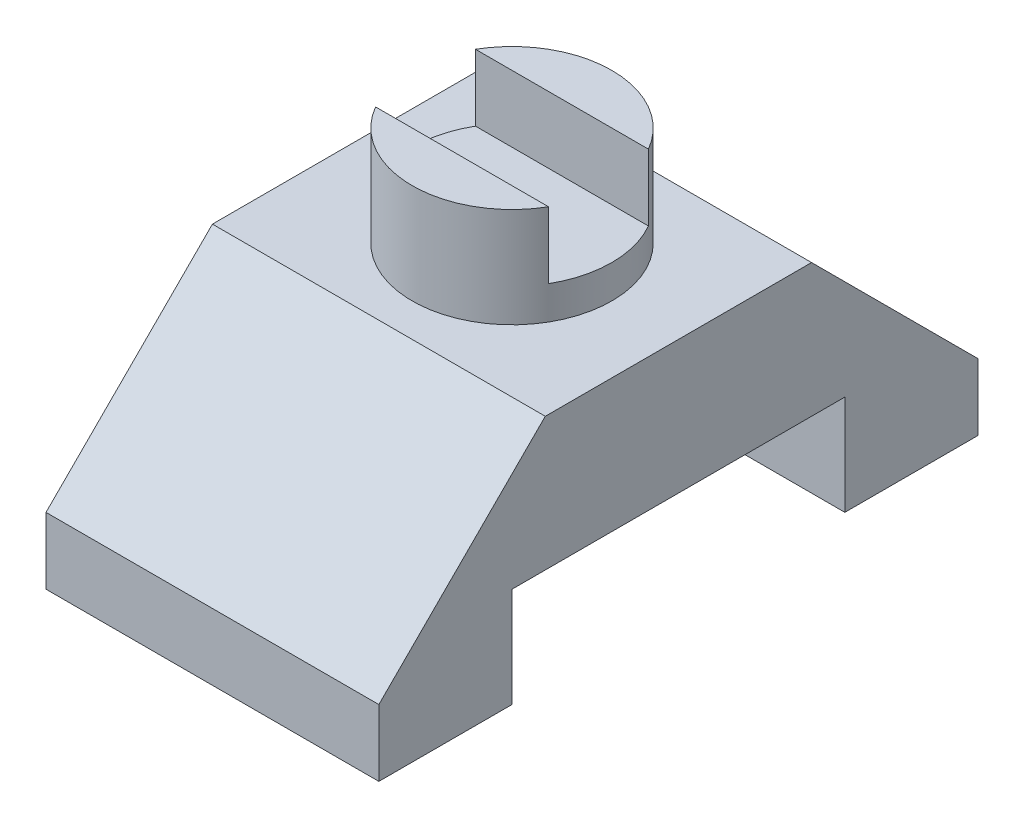
ISO-10303-21;
HEADER;
FILE_DESCRIPTION(('STEP AP214'),'2;1');
FILE_NAME('part.step','',(''),(''),'','','');
FILE_SCHEMA(('AUTOMOTIVE_DESIGN { 1 0 10303 214 1 1 1 1 }'));
ENDSEC;
DATA;
#1=APPLICATION_CONTEXT('core data for automotive mechanical design processes');
#2=APPLICATION_PROTOCOL_DEFINITION('international standard','automotive_design',2000,#1);
#3=PRODUCT_CONTEXT('',#1,'mechanical');
#4=PRODUCT('Part','Part','',(#3));
#5=PRODUCT_RELATED_PRODUCT_CATEGORY('part','',(#4));
#6=PRODUCT_DEFINITION_FORMATION('','',#4);
#7=PRODUCT_DEFINITION_CONTEXT('part definition',#1,'design');
#8=PRODUCT_DEFINITION('design','',#6,#7);
#9=PRODUCT_DEFINITION_SHAPE('','',#8);
#10=(LENGTH_UNIT() NAMED_UNIT(*) SI_UNIT(.MILLI.,.METRE.));
#11=(NAMED_UNIT(*) PLANE_ANGLE_UNIT() SI_UNIT($,.RADIAN.));
#12=(NAMED_UNIT(*) SI_UNIT($,.STERADIAN.) SOLID_ANGLE_UNIT());
#13=UNCERTAINTY_MEASURE_WITH_UNIT(LENGTH_MEASURE(1.E-05),#10,'distance_accuracy_value','');
#14=(GEOMETRIC_REPRESENTATION_CONTEXT(3) GLOBAL_UNCERTAINTY_ASSIGNED_CONTEXT((#13)) GLOBAL_UNIT_ASSIGNED_CONTEXT((#10,
#11,#12)) REPRESENTATION_CONTEXT('',''));
#15=CARTESIAN_POINT('',(0.,0.,0.));
#16=DIRECTION('',(0.,0.,1.));
#17=DIRECTION('',(1.,0.,0.));
#18=AXIS2_PLACEMENT_3D('',#15,#16,#17);
#19=CARTESIAN_POINT('',(0.,50.,-15.));
#20=DIRECTION('',(0.,1.,0.));
#21=DIRECTION('',(0.,0.,1.));
#22=AXIS2_PLACEMENT_3D('',#19,#20,#21);
#23=PLANE('',#22);
#24=DIRECTION('',(-1.,0.,0.));
#25=VECTOR('',#24,1.);
#26=CARTESIAN_POINT('',(25.001,50.,7.5));
#27=LINE('',#26,#25);
#28=CARTESIAN_POINT('',(12.9903810567666,50.,7.5));
#29=VERTEX_POINT('',#28);
#30=CARTESIAN_POINT('',(-12.9903810567666,50.,7.5));
#31=VERTEX_POINT('',#30);
#32=EDGE_CURVE('E226',#29,#31,#27,.T.);
#33=ORIENTED_EDGE('',*,*,#32,.T.);
#34=CARTESIAN_POINT('',(0.,50.,0.));
#35=DIRECTION('',(0.,-1.,0.));
#36=DIRECTION('',(0.,0.,-1.));
#37=AXIS2_PLACEMENT_3D('',#34,#35,#36);
#38=CIRCLE('',#37,15.);
#39=EDGE_CURVE('E213',#29,#31,#38,.T.);
#40=ORIENTED_EDGE('',*,*,#39,.F.);
#41=EDGE_LOOP('',(#33,#40));
#42=FACE_BOUND('',#41,.T.);
#43=ADVANCED_FACE('F33',(#42),#23,.T.);
#44=CARTESIAN_POINT('',(0.,-6.40699537949249,0.));
#45=DIRECTION('',(0.,-1.,0.));
#46=DIRECTION('',(0.,0.,-1.));
#47=AXIS2_PLACEMENT_3D('',#44,#45,#46);
#48=CYLINDRICAL_SURFACE('',#47,15.);
#49=DIRECTION('',(0.,-1.,0.));
#50=VECTOR('',#49,1.);
#51=CARTESIAN_POINT('',(-12.9903810567666,-6.40699537949249,7.50000000000001));
#52=LINE('',#51,#50);
#53=CARTESIAN_POINT('',(-12.9903810567666,40.,7.5));
#54=VERTEX_POINT('',#53);
#55=EDGE_CURVE('E242',#31,#54,#52,.T.);
#56=ORIENTED_EDGE('',*,*,#55,.T.);
#57=CARTESIAN_POINT('',(0.,40.,0.));
#58=DIRECTION('',(0.,-1.,0.));
#59=DIRECTION('',(0.,0.,-1.));
#60=AXIS2_PLACEMENT_3D('',#57,#58,#59);
#61=CIRCLE('',#60,15.);
#62=CARTESIAN_POINT('',(-12.9903810567666,40.,-7.5));
#63=VERTEX_POINT('',#62);
#64=EDGE_CURVE('E238',#54,#63,#61,.T.);
#65=ORIENTED_EDGE('',*,*,#64,.T.);
#66=DIRECTION('',(0.,-1.,0.));
#67=VECTOR('',#66,1.);
#68=CARTESIAN_POINT('',(-12.9903810567666,-6.40699537949249,-7.50000000000001));
#69=LINE('',#68,#67);
#70=CARTESIAN_POINT('',(-12.9903810567666,50.,-7.5));
#71=VERTEX_POINT('',#70);
#72=EDGE_CURVE('E239',#63,#71,#69,.F.);
#73=ORIENTED_EDGE('',*,*,#72,.T.);
#74=CARTESIAN_POINT('',(12.9903810567666,50.,-7.5));
#75=VERTEX_POINT('',#74);
#76=EDGE_CURVE('E216',#71,#75,#38,.T.);
#77=ORIENTED_EDGE('',*,*,#76,.T.);
#78=DIRECTION('',(0.,-1.,0.));
#79=VECTOR('',#78,1.);
#80=CARTESIAN_POINT('',(12.9903810567666,-6.40699537949249,-7.50000000000001));
#81=LINE('',#80,#79);
#82=CARTESIAN_POINT('',(12.9903810567666,40.,-7.5));
#83=VERTEX_POINT('',#82);
#84=EDGE_CURVE('E235',#83,#75,#81,.F.);
#85=ORIENTED_EDGE('',*,*,#84,.F.);
#86=CARTESIAN_POINT('',(0.,40.,0.));
#87=DIRECTION('',(0.,1.,0.));
#88=DIRECTION('',(0.,0.,1.));
#89=AXIS2_PLACEMENT_3D('',#86,#87,#88);
#90=CIRCLE('',#89,15.);
#91=CARTESIAN_POINT('',(12.9903810567666,40.,7.5));
#92=VERTEX_POINT('',#91);
#93=EDGE_CURVE('E232',#92,#83,#90,.T.);
#94=ORIENTED_EDGE('',*,*,#93,.F.);
#95=DIRECTION('',(0.,-1.,0.));
#96=VECTOR('',#95,1.);
#97=CARTESIAN_POINT('',(12.9903810567666,-6.40699537949249,7.50000000000001));
#98=LINE('',#97,#96);
#99=EDGE_CURVE('E229',#29,#92,#98,.T.);
#100=ORIENTED_EDGE('',*,*,#99,.F.);
#101=ORIENTED_EDGE('',*,*,#39,.T.);
#102=EDGE_LOOP('',(#56,#65,#73,#77,#85,#94,#100,#101));
#103=FACE_BOUND('',#102,.T.);
#104=CARTESIAN_POINT('',(0.,35.,0.));
#105=DIRECTION('',(0.,-1.,0.));
#106=DIRECTION('',(0.,0.,-1.));
#107=AXIS2_PLACEMENT_3D('',#104,#105,#106);
#108=CIRCLE('',#107,15.);
#109=CARTESIAN_POINT('',(0.,35.,-15.));
#110=VERTEX_POINT('',#109);
#111=EDGE_CURVE('E149',#110,#110,#108,.T.);
#112=ORIENTED_EDGE('',*,*,#111,.F.);
#113=EDGE_LOOP('',(#112));
#114=FACE_BOUND('',#113,.T.);
#115=ADVANCED_FACE('F249',(#103,#114),#48,.T.);
#116=ORIENTED_EDGE('',*,*,#76,.F.);
#117=DIRECTION('',(-1.,0.,0.));
#118=VECTOR('',#117,1.);
#119=CARTESIAN_POINT('',(25.001,50.,-7.5));
#120=LINE('',#119,#118);
#121=EDGE_CURVE('E223',#75,#71,#120,.T.);
#122=ORIENTED_EDGE('',*,*,#121,.F.);
#123=EDGE_LOOP('',(#116,#122));
#124=FACE_BOUND('',#123,.T.);
#125=ADVANCED_FACE('F280',(#124),#23,.T.);
#126=CARTESIAN_POINT('',(25.,10.,45.));
#127=DIRECTION('',(0.,0.,-1.));
#128=DIRECTION('',(-1.,0.,0.));
#129=AXIS2_PLACEMENT_3D('',#126,#127,#128);
#130=PLANE('',#129);
#131=DIRECTION('',(0.,-1.,0.));
#132=VECTOR('',#131,1.);
#133=CARTESIAN_POINT('',(-25.,10.,45.));
#134=LINE('',#133,#132);
#135=CARTESIAN_POINT('',(-25.,10.,45.));
#136=VERTEX_POINT('',#135);
#137=CARTESIAN_POINT('',(-25.,0.,45.));
#138=VERTEX_POINT('',#137);
#139=EDGE_CURVE('E145',#136,#138,#134,.T.);
#140=ORIENTED_EDGE('',*,*,#139,.T.);
#141=DIRECTION('',(-1.,0.,0.));
#142=VECTOR('',#141,1.);
#143=CARTESIAN_POINT('',(25.,0.,45.));
#144=LINE('',#143,#142);
#145=CARTESIAN_POINT('',(25.,0.,45.));
#146=VERTEX_POINT('',#145);
#147=EDGE_CURVE('E11',#146,#138,#144,.T.);
#148=ORIENTED_EDGE('',*,*,#147,.F.);
#149=DIRECTION('',(0.,-1.,0.));
#150=VECTOR('',#149,1.);
#151=CARTESIAN_POINT('',(25.,10.,45.));
#152=LINE('',#151,#150);
#153=CARTESIAN_POINT('',(25.,10.,45.));
#154=VERTEX_POINT('',#153);
#155=EDGE_CURVE('E164',#154,#146,#152,.T.);
#156=ORIENTED_EDGE('',*,*,#155,.F.);
#157=DIRECTION('',(-1.,0.,0.));
#158=VECTOR('',#157,1.);
#159=CARTESIAN_POINT('',(25.,10.,45.));
#160=LINE('',#159,#158);
#161=EDGE_CURVE('E141',#154,#136,#160,.T.);
#162=ORIENTED_EDGE('',*,*,#161,.T.);
#163=EDGE_LOOP('',(#140,#148,#156,#162));
#164=FACE_BOUND('',#163,.T.);
#165=ADVANCED_FACE('F35',(#164),#130,.F.);
#166=CARTESIAN_POINT('',(25.,0.,45.));
#167=DIRECTION('',(0.,1.,0.));
#168=DIRECTION('',(0.,0.,1.));
#169=AXIS2_PLACEMENT_3D('',#166,#167,#168);
#170=PLANE('',#169);
#171=DIRECTION('',(0.,0.,-1.));
#172=VECTOR('',#171,1.);
#173=CARTESIAN_POINT('',(-25.,0.,45.));
#174=LINE('',#173,#172);
#175=CARTESIAN_POINT('',(-25.,0.,25.));
#176=VERTEX_POINT('',#175);
#177=EDGE_CURVE('E148',#138,#176,#174,.T.);
#178=ORIENTED_EDGE('',*,*,#177,.T.);
#179=DIRECTION('',(-1.,0.,0.));
#180=VECTOR('',#179,1.);
#181=CARTESIAN_POINT('',(25.,0.,25.));
#182=LINE('',#181,#180);
#183=CARTESIAN_POINT('',(25.,0.,25.));
#184=VERTEX_POINT('',#183);
#185=EDGE_CURVE('E42',#184,#176,#182,.T.);
#186=ORIENTED_EDGE('',*,*,#185,.F.);
#187=DIRECTION('',(0.,0.,-1.));
#188=VECTOR('',#187,1.);
#189=CARTESIAN_POINT('',(25.,0.,45.));
#190=LINE('',#189,#188);
#191=EDGE_CURVE('E100',#146,#184,#190,.T.);
#192=ORIENTED_EDGE('',*,*,#191,.F.);
#193=ORIENTED_EDGE('',*,*,#147,.T.);
#194=EDGE_LOOP('',(#178,#186,#192,#193));
#195=FACE_BOUND('',#194,.T.);
#196=ADVANCED_FACE('F287',(#195),#170,.F.);
#197=CARTESIAN_POINT('',(25.,0.,25.));
#198=DIRECTION('',(0.,0.,1.));
#199=DIRECTION('',(1.,0.,0.));
#200=AXIS2_PLACEMENT_3D('',#197,#198,#199);
#201=PLANE('',#200);
#202=DIRECTION('',(0.,1.,0.));
#203=VECTOR('',#202,1.);
#204=CARTESIAN_POINT('',(-25.,0.,25.));
#205=LINE('',#204,#203);
#206=CARTESIAN_POINT('',(-25.,15.,25.));
#207=VERTEX_POINT('',#206);
#208=EDGE_CURVE('E151',#176,#207,#205,.T.);
#209=ORIENTED_EDGE('',*,*,#208,.T.);
#210=DIRECTION('',(-1.,0.,0.));
#211=VECTOR('',#210,1.);
#212=CARTESIAN_POINT('',(25.,15.,25.));
#213=LINE('',#212,#211);
#214=CARTESIAN_POINT('',(25.,15.,25.));
#215=VERTEX_POINT('',#214);
#216=EDGE_CURVE('E177',#215,#207,#213,.T.);
#217=ORIENTED_EDGE('',*,*,#216,.F.);
#218=DIRECTION('',(0.,1.,0.));
#219=VECTOR('',#218,1.);
#220=CARTESIAN_POINT('',(25.,0.,25.));
#221=LINE('',#220,#219);
#222=EDGE_CURVE('E185',#184,#215,#221,.T.);
#223=ORIENTED_EDGE('',*,*,#222,.F.);
#224=ORIENTED_EDGE('',*,*,#185,.T.);
#225=EDGE_LOOP('',(#209,#217,#223,#224));
#226=FACE_BOUND('',#225,.T.);
#227=ADVANCED_FACE('F183',(#226),#201,.F.);
#228=CARTESIAN_POINT('',(25.,15.,25.));
#229=DIRECTION('',(0.,1.,0.));
#230=DIRECTION('',(0.,0.,1.));
#231=AXIS2_PLACEMENT_3D('',#228,#229,#230);
#232=PLANE('',#231);
#233=DIRECTION('',(0.,0.,-1.));
#234=VECTOR('',#233,1.);
#235=CARTESIAN_POINT('',(-25.,15.,25.));
#236=LINE('',#235,#234);
#237=CARTESIAN_POINT('',(-25.,15.,-25.));
#238=VERTEX_POINT('',#237);
#239=EDGE_CURVE('E153',#207,#238,#236,.T.);
#240=ORIENTED_EDGE('',*,*,#239,.T.);
#241=DIRECTION('',(-1.,0.,0.));
#242=VECTOR('',#241,1.);
#243=CARTESIAN_POINT('',(25.,15.,-25.));
#244=LINE('',#243,#242);
#245=CARTESIAN_POINT('',(25.,15.,-25.));
#246=VERTEX_POINT('',#245);
#247=EDGE_CURVE('E174',#246,#238,#244,.T.);
#248=ORIENTED_EDGE('',*,*,#247,.F.);
#249=DIRECTION('',(0.,0.,-1.));
#250=VECTOR('',#249,1.);
#251=CARTESIAN_POINT('',(25.,15.,25.));
#252=LINE('',#251,#250);
#253=EDGE_CURVE('E203',#215,#246,#252,.T.);
#254=ORIENTED_EDGE('',*,*,#253,.F.);
#255=ORIENTED_EDGE('',*,*,#216,.T.);
#256=EDGE_LOOP('',(#240,#248,#254,#255));
#257=FACE_BOUND('',#256,.T.);
#258=ADVANCED_FACE('F194',(#257),#232,.F.);
#259=CARTESIAN_POINT('',(25.,15.,-25.));
#260=DIRECTION('',(0.,0.,-1.));
#261=DIRECTION('',(-1.,0.,0.));
#262=AXIS2_PLACEMENT_3D('',#259,#260,#261);
#263=PLANE('',#262);
#264=DIRECTION('',(0.,-1.,0.));
#265=VECTOR('',#264,1.);
#266=CARTESIAN_POINT('',(-25.,15.,-25.));
#267=LINE('',#266,#265);
#268=CARTESIAN_POINT('',(-25.,0.,-25.));
#269=VERTEX_POINT('',#268);
#270=EDGE_CURVE('E155',#238,#269,#267,.T.);
#271=ORIENTED_EDGE('',*,*,#270,.T.);
#272=DIRECTION('',(-1.,0.,0.));
#273=VECTOR('',#272,1.);
#274=CARTESIAN_POINT('',(25.,0.,-25.));
#275=LINE('',#274,#273);
#276=CARTESIAN_POINT('',(25.,0.,-25.));
#277=VERTEX_POINT('',#276);
#278=EDGE_CURVE('E171',#277,#269,#275,.T.);
#279=ORIENTED_EDGE('',*,*,#278,.F.);
#280=DIRECTION('',(0.,-1.,0.));
#281=VECTOR('',#280,1.);
#282=CARTESIAN_POINT('',(25.,15.,-25.));
#283=LINE('',#282,#281);
#284=EDGE_CURVE('E200',#246,#277,#283,.T.);
#285=ORIENTED_EDGE('',*,*,#284,.F.);
#286=ORIENTED_EDGE('',*,*,#247,.T.);
#287=EDGE_LOOP('',(#271,#279,#285,#286));
#288=FACE_BOUND('',#287,.T.);
#289=ADVANCED_FACE('F198',(#288),#263,.F.);
#290=CARTESIAN_POINT('',(25.,0.,-25.));
#291=DIRECTION('',(0.,1.,0.));
#292=DIRECTION('',(0.,0.,1.));
#293=AXIS2_PLACEMENT_3D('',#290,#291,#292);
#294=PLANE('',#293);
#295=DIRECTION('',(0.,0.,-1.));
#296=VECTOR('',#295,1.);
#297=CARTESIAN_POINT('',(-25.,0.,-25.));
#298=LINE('',#297,#296);
#299=CARTESIAN_POINT('',(-25.,0.,-45.));
#300=VERTEX_POINT('',#299);
#301=EDGE_CURVE('E157',#269,#300,#298,.T.);
#302=ORIENTED_EDGE('',*,*,#301,.T.);
#303=DIRECTION('',(-1.,0.,0.));
#304=VECTOR('',#303,1.);
#305=CARTESIAN_POINT('',(25.,0.,-45.));
#306=LINE('',#305,#304);
#307=CARTESIAN_POINT('',(25.,0.,-45.));
#308=VERTEX_POINT('',#307);
#309=EDGE_CURVE('E168',#308,#300,#306,.T.);
#310=ORIENTED_EDGE('',*,*,#309,.F.);
#311=DIRECTION('',(0.,0.,-1.));
#312=VECTOR('',#311,1.);
#313=CARTESIAN_POINT('',(25.,0.,-25.));
#314=LINE('',#313,#312);
#315=EDGE_CURVE('E202',#277,#308,#314,.T.);
#316=ORIENTED_EDGE('',*,*,#315,.F.);
#317=ORIENTED_EDGE('',*,*,#278,.T.);
#318=EDGE_LOOP('',(#302,#310,#316,#317));
#319=FACE_BOUND('',#318,.T.);
#320=ADVANCED_FACE('F324',(#319),#294,.F.);
#321=CARTESIAN_POINT('',(25.,0.,-45.));
#322=DIRECTION('',(0.,0.,1.));
#323=DIRECTION('',(1.,0.,0.));
#324=AXIS2_PLACEMENT_3D('',#321,#322,#323);
#325=PLANE('',#324);
#326=DIRECTION('',(0.,1.,0.));
#327=VECTOR('',#326,1.);
#328=CARTESIAN_POINT('',(-25.,0.,-45.));
#329=LINE('',#328,#327);
#330=CARTESIAN_POINT('',(-25.,10.,-45.));
#331=VERTEX_POINT('',#330);
#332=EDGE_CURVE('E159',#300,#331,#329,.T.);
#333=ORIENTED_EDGE('',*,*,#332,.T.);
#334=DIRECTION('',(-1.,0.,0.));
#335=VECTOR('',#334,1.);
#336=CARTESIAN_POINT('',(25.,10.,-45.));
#337=LINE('',#336,#335);
#338=CARTESIAN_POINT('',(25.,10.,-45.));
#339=VERTEX_POINT('',#338);
#340=EDGE_CURVE('E136',#339,#331,#337,.T.);
#341=ORIENTED_EDGE('',*,*,#340,.F.);
#342=DIRECTION('',(0.,1.,0.));
#343=VECTOR('',#342,1.);
#344=CARTESIAN_POINT('',(25.,0.,-45.));
#345=LINE('',#344,#343);
#346=EDGE_CURVE('E127',#308,#339,#345,.T.);
#347=ORIENTED_EDGE('',*,*,#346,.F.);
#348=ORIENTED_EDGE('',*,*,#309,.T.);
#349=EDGE_LOOP('',(#333,#341,#347,#348));
#350=FACE_BOUND('',#349,.T.);
#351=ADVANCED_FACE('F321',(#350),#325,.F.);
#352=CARTESIAN_POINT('',(25.,10.,-45.));
#353=DIRECTION('',(0.,-0.707106781186547,0.707106781186548));
#354=DIRECTION('',(0.,-0.707106781186548,-0.707106781186547));
#355=AXIS2_PLACEMENT_3D('',#352,#353,#354);
#356=PLANE('',#355);
#357=DIRECTION('',(0.,0.707106781186548,0.707106781186547));
#358=VECTOR('',#357,1.);
#359=CARTESIAN_POINT('',(-25.,10.,-45.));
#360=LINE('',#359,#358);
#361=CARTESIAN_POINT('',(-25.,35.,-20.));
#362=VERTEX_POINT('',#361);
#363=EDGE_CURVE('E135',#331,#362,#360,.T.);
#364=ORIENTED_EDGE('',*,*,#363,.T.);
#365=DIRECTION('',(-1.,0.,0.));
#366=VECTOR('',#365,1.);
#367=CARTESIAN_POINT('',(25.,35.,-20.));
#368=LINE('',#367,#366);
#369=CARTESIAN_POINT('',(25.,35.,-20.));
#370=VERTEX_POINT('',#369);
#371=EDGE_CURVE('E132',#370,#362,#368,.T.);
#372=ORIENTED_EDGE('',*,*,#371,.F.);
#373=DIRECTION('',(0.,0.707106781186548,0.707106781186547));
#374=VECTOR('',#373,1.);
#375=CARTESIAN_POINT('',(25.,10.,-45.));
#376=LINE('',#375,#374);
#377=EDGE_CURVE('E121',#339,#370,#376,.T.);
#378=ORIENTED_EDGE('',*,*,#377,.F.);
#379=ORIENTED_EDGE('',*,*,#340,.T.);
#380=EDGE_LOOP('',(#364,#372,#378,#379));
#381=FACE_BOUND('',#380,.T.);
#382=ADVANCED_FACE('F133',(#381),#356,.F.);
#383=CARTESIAN_POINT('',(25.,35.,-20.));
#384=DIRECTION('',(0.,-1.,0.));
#385=DIRECTION('',(0.,0.,-1.));
#386=AXIS2_PLACEMENT_3D('',#383,#384,#385);
#387=PLANE('',#386);
#388=ORIENTED_EDGE('',*,*,#111,.T.);
#389=EDGE_LOOP('',(#388));
#390=FACE_BOUND('',#389,.T.);
#391=DIRECTION('',(0.,0.,1.));
#392=VECTOR('',#391,1.);
#393=CARTESIAN_POINT('',(-25.,35.,-20.));
#394=LINE('',#393,#392);
#395=CARTESIAN_POINT('',(-25.,35.,20.));
#396=VERTEX_POINT('',#395);
#397=EDGE_CURVE('E86',#362,#396,#394,.T.);
#398=ORIENTED_EDGE('',*,*,#397,.T.);
#399=DIRECTION('',(-1.,0.,0.));
#400=VECTOR('',#399,1.);
#401=CARTESIAN_POINT('',(25.,35.,20.));
#402=LINE('',#401,#400);
#403=CARTESIAN_POINT('',(25.,35.,20.));
#404=VERTEX_POINT('',#403);
#405=EDGE_CURVE('E137',#404,#396,#402,.T.);
#406=ORIENTED_EDGE('',*,*,#405,.F.);
#407=DIRECTION('',(0.,0.,1.));
#408=VECTOR('',#407,1.);
#409=CARTESIAN_POINT('',(25.,35.,-20.));
#410=LINE('',#409,#408);
#411=EDGE_CURVE('E125',#370,#404,#410,.T.);
#412=ORIENTED_EDGE('',*,*,#411,.F.);
#413=ORIENTED_EDGE('',*,*,#371,.T.);
#414=EDGE_LOOP('',(#398,#406,#412,#413));
#415=FACE_BOUND('',#414,.T.);
#416=ADVANCED_FACE('F139',(#390,#415),#387,.F.);
#417=CARTESIAN_POINT('',(25.,35.,20.));
#418=DIRECTION('',(0.,-0.707106781186547,-0.707106781186548));
#419=DIRECTION('',(0.,0.707106781186548,-0.707106781186547));
#420=AXIS2_PLACEMENT_3D('',#417,#418,#419);
#421=PLANE('',#420);
#422=DIRECTION('',(0.,-0.707106781186548,0.707106781186547));
#423=VECTOR('',#422,1.);
#424=CARTESIAN_POINT('',(-25.,35.,20.));
#425=LINE('',#424,#423);
#426=EDGE_CURVE('E92',#396,#136,#425,.T.);
#427=ORIENTED_EDGE('',*,*,#426,.T.);
#428=ORIENTED_EDGE('',*,*,#161,.F.);
#429=DIRECTION('',(0.,-0.707106781186548,0.707106781186547));
#430=VECTOR('',#429,1.);
#431=CARTESIAN_POINT('',(25.,35.,20.));
#432=LINE('',#431,#430);
#433=EDGE_CURVE('E50',#404,#154,#432,.T.);
#434=ORIENTED_EDGE('',*,*,#433,.F.);
#435=ORIENTED_EDGE('',*,*,#405,.T.);
#436=EDGE_LOOP('',(#427,#428,#434,#435));
#437=FACE_BOUND('',#436,.T.);
#438=ADVANCED_FACE('F311',(#437),#421,.F.);
#439=CARTESIAN_POINT('',(25.,0.,0.));
#440=DIRECTION('',(1.,0.,0.));
#441=DIRECTION('',(0.,0.,-1.));
#442=AXIS2_PLACEMENT_3D('',#439,#440,#441);
#443=PLANE('',#442);
#444=ORIENTED_EDGE('',*,*,#155,.T.);
#445=ORIENTED_EDGE('',*,*,#191,.T.);
#446=ORIENTED_EDGE('',*,*,#222,.T.);
#447=ORIENTED_EDGE('',*,*,#253,.T.);
#448=ORIENTED_EDGE('',*,*,#284,.T.);
#449=ORIENTED_EDGE('',*,*,#315,.T.);
#450=ORIENTED_EDGE('',*,*,#346,.T.);
#451=ORIENTED_EDGE('',*,*,#377,.T.);
#452=ORIENTED_EDGE('',*,*,#411,.T.);
#453=ORIENTED_EDGE('',*,*,#433,.T.);
#454=EDGE_LOOP('',(#444,#445,#446,#447,#448,#449,#450,#451,#452,#453));
#455=FACE_BOUND('',#454,.T.);
#456=ADVANCED_FACE('F123',(#455),#443,.T.);
#457=CARTESIAN_POINT('',(-25.,0.,0.));
#458=DIRECTION('',(1.,0.,0.));
#459=DIRECTION('',(0.,0.,-1.));
#460=AXIS2_PLACEMENT_3D('',#457,#458,#459);
#461=PLANE('',#460);
#462=ORIENTED_EDGE('',*,*,#139,.F.);
#463=ORIENTED_EDGE('',*,*,#426,.F.);
#464=ORIENTED_EDGE('',*,*,#397,.F.);
#465=ORIENTED_EDGE('',*,*,#363,.F.);
#466=ORIENTED_EDGE('',*,*,#332,.F.);
#467=ORIENTED_EDGE('',*,*,#301,.F.);
#468=ORIENTED_EDGE('',*,*,#270,.F.);
#469=ORIENTED_EDGE('',*,*,#239,.F.);
#470=ORIENTED_EDGE('',*,*,#208,.F.);
#471=ORIENTED_EDGE('',*,*,#177,.F.);
#472=EDGE_LOOP('',(#462,#463,#464,#465,#466,#467,#468,#469,#470,#471));
#473=FACE_BOUND('',#472,.T.);
#474=ADVANCED_FACE('F189',(#473),#461,.F.);
#475=CARTESIAN_POINT('',(0.,40.,-7.5));
#476=DIRECTION('',(0.,1.,0.));
#477=DIRECTION('',(0.,0.,1.));
#478=AXIS2_PLACEMENT_3D('',#475,#476,#477);
#479=PLANE('',#478);
#480=DIRECTION('',(-1.,0.,0.));
#481=VECTOR('',#480,1.);
#482=CARTESIAN_POINT('',(25.001,40.,-7.5));
#483=LINE('',#482,#481);
#484=EDGE_CURVE('E220',#83,#63,#483,.T.);
#485=ORIENTED_EDGE('',*,*,#484,.T.);
#486=ORIENTED_EDGE('',*,*,#64,.F.);
#487=DIRECTION('',(-1.,0.,0.));
#488=VECTOR('',#487,1.);
#489=CARTESIAN_POINT('',(25.001,40.,7.5));
#490=LINE('',#489,#488);
#491=EDGE_CURVE('E217',#92,#54,#490,.T.);
#492=ORIENTED_EDGE('',*,*,#491,.F.);
#493=ORIENTED_EDGE('',*,*,#93,.T.);
#494=EDGE_LOOP('',(#485,#486,#492,#493));
#495=FACE_BOUND('',#494,.T.);
#496=ADVANCED_FACE('F260',(#495),#479,.T.);
#497=CARTESIAN_POINT('',(25.001,50.,7.5));
#498=DIRECTION('',(0.,0.,-1.));
#499=DIRECTION('',(0.,1.,0.));
#500=AXIS2_PLACEMENT_3D('',#497,#498,#499);
#501=PLANE('',#500);
#502=ORIENTED_EDGE('',*,*,#99,.T.);
#503=ORIENTED_EDGE('',*,*,#491,.T.);
#504=ORIENTED_EDGE('',*,*,#55,.F.);
#505=ORIENTED_EDGE('',*,*,#32,.F.);
#506=EDGE_LOOP('',(#502,#503,#504,#505));
#507=FACE_BOUND('',#506,.T.);
#508=ADVANCED_FACE('F296',(#507),#501,.T.);
#509=CARTESIAN_POINT('',(25.001,50.,-7.5));
#510=DIRECTION('',(0.,0.,1.));
#511=DIRECTION('',(0.,-1.,0.));
#512=AXIS2_PLACEMENT_3D('',#509,#510,#511);
#513=PLANE('',#512);
#514=ORIENTED_EDGE('',*,*,#84,.T.);
#515=ORIENTED_EDGE('',*,*,#121,.T.);
#516=ORIENTED_EDGE('',*,*,#72,.F.);
#517=ORIENTED_EDGE('',*,*,#484,.F.);
#518=EDGE_LOOP('',(#514,#515,#516,#517));
#519=FACE_BOUND('',#518,.T.);
#520=ADVANCED_FACE('F274',(#519),#513,.T.);
#521=CLOSED_SHELL('',(#43,#115,#125,#165,#196,#227,#258,#289,#320,#351,#382,#416,#438,#456,#474,
#496,#508,#520));
#522=MANIFOLD_SOLID_BREP('B2',#521);
#523=ADVANCED_BREP_SHAPE_REPRESENTATION('',(#18,#522),#14);
#524=SHAPE_DEFINITION_REPRESENTATION(#9,#523);
ENDSEC;
END-ISO-10303-21;
